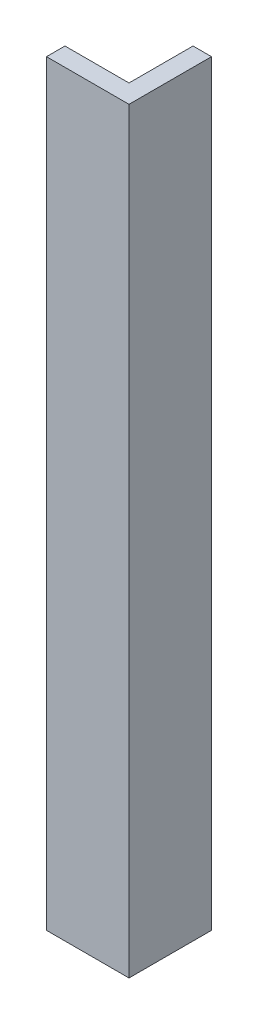
ISO-10303-21;
HEADER;
FILE_DESCRIPTION(('STEP AP214'),'2;1');
FILE_NAME('part.step','',(''),(''),'','','');
FILE_SCHEMA(('AUTOMOTIVE_DESIGN { 1 0 10303 214 1 1 1 1 }'));
ENDSEC;
DATA;
#1=APPLICATION_CONTEXT('core data for automotive mechanical design processes');
#2=APPLICATION_PROTOCOL_DEFINITION('international standard','automotive_design',2000,#1);
#3=PRODUCT_CONTEXT('',#1,'mechanical');
#4=PRODUCT('Part','Part','',(#3));
#5=PRODUCT_RELATED_PRODUCT_CATEGORY('part','',(#4));
#6=PRODUCT_DEFINITION_FORMATION('','',#4);
#7=PRODUCT_DEFINITION_CONTEXT('part definition',#1,'design');
#8=PRODUCT_DEFINITION('design','',#6,#7);
#9=PRODUCT_DEFINITION_SHAPE('','',#8);
#10=(LENGTH_UNIT() NAMED_UNIT(*) SI_UNIT(.MILLI.,.METRE.));
#11=(NAMED_UNIT(*) PLANE_ANGLE_UNIT() SI_UNIT($,.RADIAN.));
#12=(NAMED_UNIT(*) SI_UNIT($,.STERADIAN.) SOLID_ANGLE_UNIT());
#13=UNCERTAINTY_MEASURE_WITH_UNIT(LENGTH_MEASURE(1.E-05),#10,'distance_accuracy_value','');
#14=(GEOMETRIC_REPRESENTATION_CONTEXT(3) GLOBAL_UNCERTAINTY_ASSIGNED_CONTEXT((#13)) GLOBAL_UNIT_ASSIGNED_CONTEXT((#10,
#11,#12)) REPRESENTATION_CONTEXT('',''));
#15=CARTESIAN_POINT('',(0.,0.,0.));
#16=DIRECTION('',(0.,0.,1.));
#17=DIRECTION('',(1.,0.,0.));
#18=AXIS2_PLACEMENT_3D('',#15,#16,#17);
#19=CARTESIAN_POINT('',(-3.17500000000001,130.,-3.17500000000001));
#20=DIRECTION('',(-1.,0.,0.));
#21=DIRECTION('',(0.,0.,1.));
#22=AXIS2_PLACEMENT_3D('',#19,#20,#21);
#23=PLANE('',#22);
#24=DIRECTION('',(0.,0.,-1.));
#25=VECTOR('',#24,1.);
#26=CARTESIAN_POINT('',(-3.17500000000001,0.,-3.17500000000001));
#27=LINE('',#26,#25);
#28=CARTESIAN_POINT('',(-3.17500000000001,0.,-3.17500000000001));
#29=VERTEX_POINT('',#28);
#30=CARTESIAN_POINT('',(-3.175,0.,-14.175));
#31=VERTEX_POINT('',#30);
#32=EDGE_CURVE('E118',#29,#31,#27,.T.);
#33=ORIENTED_EDGE('',*,*,#32,.F.);
#34=DIRECTION('',(0.,-1.,0.));
#35=VECTOR('',#34,1.);
#36=CARTESIAN_POINT('',(-3.17500000000001,130.,-3.17500000000001));
#37=LINE('',#36,#35);
#38=CARTESIAN_POINT('',(-3.17500000000001,130.,-3.17500000000001));
#39=VERTEX_POINT('',#38);
#40=EDGE_CURVE('E11',#39,#29,#37,.T.);
#41=ORIENTED_EDGE('',*,*,#40,.F.);
#42=DIRECTION('',(0.,0.,-1.));
#43=VECTOR('',#42,1.);
#44=CARTESIAN_POINT('',(-3.17500000000001,130.,-3.17500000000001));
#45=LINE('',#44,#43);
#46=CARTESIAN_POINT('',(-3.175,130.,-14.175));
#47=VERTEX_POINT('',#46);
#48=EDGE_CURVE('E130',#39,#47,#45,.T.);
#49=ORIENTED_EDGE('',*,*,#48,.T.);
#50=DIRECTION('',(0.,-1.,0.));
#51=VECTOR('',#50,1.);
#52=CARTESIAN_POINT('',(-3.175,130.,-14.175));
#53=LINE('',#52,#51);
#54=EDGE_CURVE('E36',#47,#31,#53,.T.);
#55=ORIENTED_EDGE('',*,*,#54,.T.);
#56=EDGE_LOOP('',(#33,#41,#49,#55));
#57=FACE_BOUND('',#56,.T.);
#58=ADVANCED_FACE('F33',(#57),#23,.T.);
#59=CARTESIAN_POINT('',(-3.17500000000001,130.,-3.17500000000001));
#60=DIRECTION('',(0.,0.,1.));
#61=DIRECTION('',(1.,0.,0.));
#62=AXIS2_PLACEMENT_3D('',#59,#60,#61);
#63=PLANE('',#62);
#64=DIRECTION('',(-1.,0.,0.));
#65=VECTOR('',#64,1.);
#66=CARTESIAN_POINT('',(-3.17500000000001,0.,-3.17500000000001));
#67=LINE('',#66,#65);
#68=CARTESIAN_POINT('',(-14.175,0.,-3.175));
#69=VERTEX_POINT('',#68);
#70=EDGE_CURVE('E72',#29,#69,#67,.T.);
#71=ORIENTED_EDGE('',*,*,#70,.T.);
#72=DIRECTION('',(0.,-1.,0.));
#73=VECTOR('',#72,1.);
#74=CARTESIAN_POINT('',(-14.175,130.,-3.175));
#75=LINE('',#74,#73);
#76=CARTESIAN_POINT('',(-14.175,130.,-3.175));
#77=VERTEX_POINT('',#76);
#78=EDGE_CURVE('E42',#77,#69,#75,.T.);
#79=ORIENTED_EDGE('',*,*,#78,.F.);
#80=DIRECTION('',(-1.,0.,0.));
#81=VECTOR('',#80,1.);
#82=CARTESIAN_POINT('',(-3.17500000000001,130.,-3.17500000000001));
#83=LINE('',#82,#81);
#84=EDGE_CURVE('E98',#39,#77,#83,.T.);
#85=ORIENTED_EDGE('',*,*,#84,.F.);
#86=ORIENTED_EDGE('',*,*,#40,.T.);
#87=EDGE_LOOP('',(#71,#79,#85,#86));
#88=FACE_BOUND('',#87,.T.);
#89=ADVANCED_FACE('F151',(#88),#63,.F.);
#90=CARTESIAN_POINT('',(-14.175,130.,-3.175));
#91=DIRECTION('',(1.,0.,0.));
#92=DIRECTION('',(0.,0.,-1.));
#93=AXIS2_PLACEMENT_3D('',#90,#91,#92);
#94=PLANE('',#93);
#95=DIRECTION('',(0.,0.,1.));
#96=VECTOR('',#95,1.);
#97=CARTESIAN_POINT('',(-14.175,0.,-3.175));
#98=LINE('',#97,#96);
#99=CARTESIAN_POINT('',(-14.175,0.,0.));
#100=VERTEX_POINT('',#99);
#101=EDGE_CURVE('E105',#69,#100,#98,.T.);
#102=ORIENTED_EDGE('',*,*,#101,.T.);
#103=DIRECTION('',(0.,-1.,0.));
#104=VECTOR('',#103,1.);
#105=CARTESIAN_POINT('',(-14.175,130.,0.));
#106=LINE('',#105,#104);
#107=CARTESIAN_POINT('',(-14.175,130.,0.));
#108=VERTEX_POINT('',#107);
#109=EDGE_CURVE('E102',#108,#100,#106,.T.);
#110=ORIENTED_EDGE('',*,*,#109,.F.);
#111=DIRECTION('',(0.,0.,1.));
#112=VECTOR('',#111,1.);
#113=CARTESIAN_POINT('',(-14.175,130.,-3.175));
#114=LINE('',#113,#112);
#115=EDGE_CURVE('E92',#77,#108,#114,.T.);
#116=ORIENTED_EDGE('',*,*,#115,.F.);
#117=ORIENTED_EDGE('',*,*,#78,.T.);
#118=EDGE_LOOP('',(#102,#110,#116,#117));
#119=FACE_BOUND('',#118,.T.);
#120=ADVANCED_FACE('F103',(#119),#94,.F.);
#121=CARTESIAN_POINT('',(0.,130.,0.));
#122=DIRECTION('',(0.,0.,1.));
#123=DIRECTION('',(1.,0.,0.));
#124=AXIS2_PLACEMENT_3D('',#121,#122,#123);
#125=PLANE('',#124);
#126=DIRECTION('',(-1.,0.,0.));
#127=VECTOR('',#126,1.);
#128=CARTESIAN_POINT('',(0.,0.,0.));
#129=LINE('',#128,#127);
#130=CARTESIAN_POINT('',(0.,0.,0.));
#131=VERTEX_POINT('',#130);
#132=EDGE_CURVE('E127',#131,#100,#129,.T.);
#133=ORIENTED_EDGE('',*,*,#132,.F.);
#134=DIRECTION('',(0.,-1.,0.));
#135=VECTOR('',#134,1.);
#136=CARTESIAN_POINT('',(0.,130.,0.));
#137=LINE('',#136,#135);
#138=CARTESIAN_POINT('',(0.,130.,0.));
#139=VERTEX_POINT('',#138);
#140=EDGE_CURVE('E109',#139,#131,#137,.T.);
#141=ORIENTED_EDGE('',*,*,#140,.F.);
#142=DIRECTION('',(-1.,0.,0.));
#143=VECTOR('',#142,1.);
#144=CARTESIAN_POINT('',(0.,130.,0.));
#145=LINE('',#144,#143);
#146=EDGE_CURVE('E96',#139,#108,#145,.T.);
#147=ORIENTED_EDGE('',*,*,#146,.T.);
#148=ORIENTED_EDGE('',*,*,#109,.T.);
#149=EDGE_LOOP('',(#133,#141,#147,#148));
#150=FACE_BOUND('',#149,.T.);
#151=ADVANCED_FACE('F111',(#150),#125,.T.);
#152=CARTESIAN_POINT('',(0.,130.,-14.175));
#153=DIRECTION('',(1.,0.,0.));
#154=DIRECTION('',(0.,0.,-1.));
#155=AXIS2_PLACEMENT_3D('',#152,#153,#154);
#156=PLANE('',#155);
#157=DIRECTION('',(0.,0.,1.));
#158=VECTOR('',#157,1.);
#159=CARTESIAN_POINT('',(0.,0.,-14.175));
#160=LINE('',#159,#158);
#161=CARTESIAN_POINT('',(0.,0.,-14.175));
#162=VERTEX_POINT('',#161);
#163=EDGE_CURVE('E124',#162,#131,#160,.T.);
#164=ORIENTED_EDGE('',*,*,#163,.F.);
#165=DIRECTION('',(0.,-1.,0.));
#166=VECTOR('',#165,1.);
#167=CARTESIAN_POINT('',(0.,130.,-14.175));
#168=LINE('',#167,#166);
#169=CARTESIAN_POINT('',(0.,130.,-14.175));
#170=VERTEX_POINT('',#169);
#171=EDGE_CURVE('E133',#170,#162,#168,.T.);
#172=ORIENTED_EDGE('',*,*,#171,.F.);
#173=DIRECTION('',(0.,0.,1.));
#174=VECTOR('',#173,1.);
#175=CARTESIAN_POINT('',(0.,130.,-14.175));
#176=LINE('',#175,#174);
#177=EDGE_CURVE('E112',#170,#139,#176,.T.);
#178=ORIENTED_EDGE('',*,*,#177,.T.);
#179=ORIENTED_EDGE('',*,*,#140,.T.);
#180=EDGE_LOOP('',(#164,#172,#178,#179));
#181=FACE_BOUND('',#180,.T.);
#182=ADVANCED_FACE('F141',(#181),#156,.T.);
#183=CARTESIAN_POINT('',(0.,130.,-14.175));
#184=DIRECTION('',(0.,0.,1.));
#185=DIRECTION('',(1.,0.,0.));
#186=AXIS2_PLACEMENT_3D('',#183,#184,#185);
#187=PLANE('',#186);
#188=DIRECTION('',(-1.,0.,0.));
#189=VECTOR('',#188,1.);
#190=CARTESIAN_POINT('',(0.,0.,-14.175));
#191=LINE('',#190,#189);
#192=EDGE_CURVE('E121',#162,#31,#191,.T.);
#193=ORIENTED_EDGE('',*,*,#192,.T.);
#194=ORIENTED_EDGE('',*,*,#54,.F.);
#195=DIRECTION('',(-1.,0.,0.));
#196=VECTOR('',#195,1.);
#197=CARTESIAN_POINT('',(0.,130.,-14.175));
#198=LINE('',#197,#196);
#199=EDGE_CURVE('E82',#170,#47,#198,.T.);
#200=ORIENTED_EDGE('',*,*,#199,.F.);
#201=ORIENTED_EDGE('',*,*,#171,.T.);
#202=EDGE_LOOP('',(#193,#194,#200,#201));
#203=FACE_BOUND('',#202,.T.);
#204=ADVANCED_FACE('F136',(#203),#187,.F.);
#205=CARTESIAN_POINT('',(0.,130.,0.));
#206=DIRECTION('',(0.,1.,0.));
#207=DIRECTION('',(0.,0.,1.));
#208=AXIS2_PLACEMENT_3D('',#205,#206,#207);
#209=PLANE('',#208);
#210=ORIENTED_EDGE('',*,*,#48,.F.);
#211=ORIENTED_EDGE('',*,*,#84,.T.);
#212=ORIENTED_EDGE('',*,*,#115,.T.);
#213=ORIENTED_EDGE('',*,*,#146,.F.);
#214=ORIENTED_EDGE('',*,*,#177,.F.);
#215=ORIENTED_EDGE('',*,*,#199,.T.);
#216=EDGE_LOOP('',(#210,#211,#212,#213,#214,#215));
#217=FACE_BOUND('',#216,.T.);
#218=ADVANCED_FACE('F94',(#217),#209,.T.);
#219=CARTESIAN_POINT('',(0.,0.,0.));
#220=DIRECTION('',(0.,1.,0.));
#221=DIRECTION('',(0.,0.,1.));
#222=AXIS2_PLACEMENT_3D('',#219,#220,#221);
#223=PLANE('',#222);
#224=ORIENTED_EDGE('',*,*,#32,.T.);
#225=ORIENTED_EDGE('',*,*,#192,.F.);
#226=ORIENTED_EDGE('',*,*,#163,.T.);
#227=ORIENTED_EDGE('',*,*,#132,.T.);
#228=ORIENTED_EDGE('',*,*,#101,.F.);
#229=ORIENTED_EDGE('',*,*,#70,.F.);
#230=EDGE_LOOP('',(#224,#225,#226,#227,#228,#229));
#231=FACE_BOUND('',#230,.T.);
#232=ADVANCED_FACE('F139',(#231),#223,.F.);
#233=CLOSED_SHELL('',(#58,#89,#120,#151,#182,#204,#218,#232));
#234=MANIFOLD_SOLID_BREP('B2',#233);
#235=ADVANCED_BREP_SHAPE_REPRESENTATION('',(#18,#234),#14);
#236=SHAPE_DEFINITION_REPRESENTATION(#9,#235);
ENDSEC;
END-ISO-10303-21;
